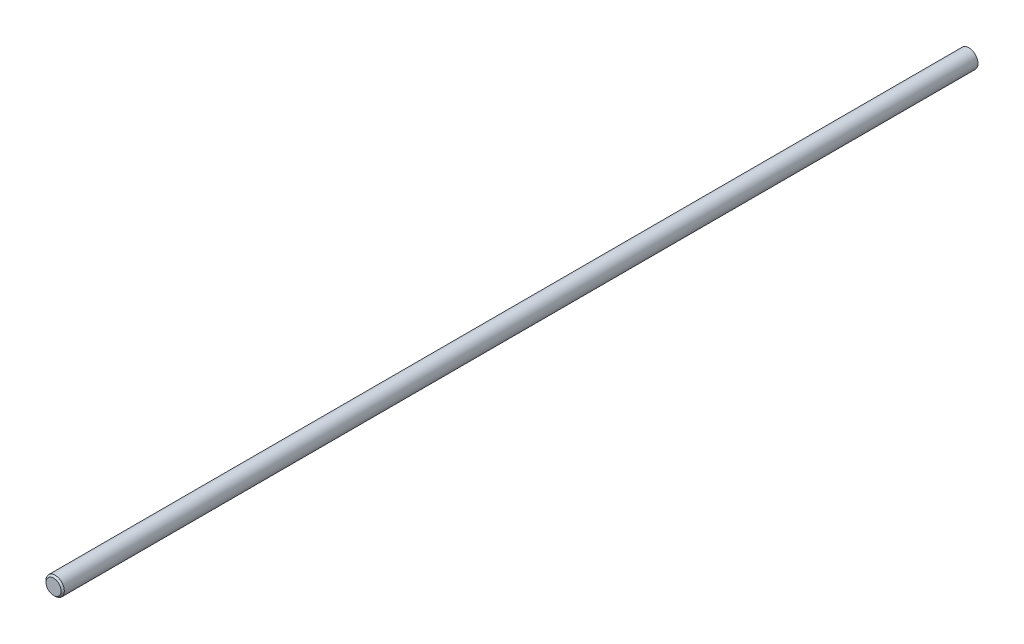
ISO-10303-21;
HEADER;
FILE_DESCRIPTION(('STEP AP214'),'2;1');
FILE_NAME('part.step','',(''),(''),'','','');
FILE_SCHEMA(('AUTOMOTIVE_DESIGN { 1 0 10303 214 1 1 1 1 }'));
ENDSEC;
DATA;
#1=APPLICATION_CONTEXT('core data for automotive mechanical design processes');
#2=APPLICATION_PROTOCOL_DEFINITION('international standard','automotive_design',2000,#1);
#3=PRODUCT_CONTEXT('',#1,'mechanical');
#4=PRODUCT('Part','Part','',(#3));
#5=PRODUCT_RELATED_PRODUCT_CATEGORY('part','',(#4));
#6=PRODUCT_DEFINITION_FORMATION('','',#4);
#7=PRODUCT_DEFINITION_CONTEXT('part definition',#1,'design');
#8=PRODUCT_DEFINITION('design','',#6,#7);
#9=PRODUCT_DEFINITION_SHAPE('','',#8);
#10=(LENGTH_UNIT() NAMED_UNIT(*) SI_UNIT(.MILLI.,.METRE.));
#11=(NAMED_UNIT(*) PLANE_ANGLE_UNIT() SI_UNIT($,.RADIAN.));
#12=(NAMED_UNIT(*) SI_UNIT($,.STERADIAN.) SOLID_ANGLE_UNIT());
#13=UNCERTAINTY_MEASURE_WITH_UNIT(LENGTH_MEASURE(1.E-05),#10,'distance_accuracy_value','');
#14=(GEOMETRIC_REPRESENTATION_CONTEXT(3) GLOBAL_UNCERTAINTY_ASSIGNED_CONTEXT((#13)) GLOBAL_UNIT_ASSIGNED_CONTEXT((#10,
#11,#12)) REPRESENTATION_CONTEXT('',''));
#15=CARTESIAN_POINT('',(0.,0.,0.));
#16=DIRECTION('',(0.,0.,1.));
#17=DIRECTION('',(1.,0.,0.));
#18=AXIS2_PLACEMENT_3D('',#15,#16,#17);
#19=CARTESIAN_POINT('',(0.,0.,250.));
#20=DIRECTION('',(0.,0.,-1.));
#21=DIRECTION('',(-1.,0.,0.));
#22=AXIS2_PLACEMENT_3D('',#19,#20,#21);
#23=CYLINDRICAL_SURFACE('',#22,2.5);
#24=CARTESIAN_POINT('',(0.,0.,249.555));
#25=DIRECTION('',(0.,0.,-1.));
#26=DIRECTION('',(-1.,0.,0.));
#27=AXIS2_PLACEMENT_3D('',#24,#25,#26);
#28=CIRCLE('',#27,2.49999999999998);
#29=CARTESIAN_POINT('',(-2.49999999999998,0.,249.555));
#30=VERTEX_POINT('',#29);
#31=EDGE_CURVE('E48',#30,#30,#28,.T.);
#32=ORIENTED_EDGE('',*,*,#31,.T.);
#33=EDGE_LOOP('',(#32));
#34=FACE_BOUND('',#33,.T.);
#35=CARTESIAN_POINT('',(0.,0.,0.));
#36=DIRECTION('',(0.,0.,1.));
#37=DIRECTION('',(1.,0.,0.));
#38=AXIS2_PLACEMENT_3D('',#35,#36,#37);
#39=CIRCLE('',#38,2.5);
#40=CARTESIAN_POINT('',(2.5,0.,0.));
#41=VERTEX_POINT('',#40);
#42=EDGE_CURVE('E10',#41,#41,#39,.T.);
#43=ORIENTED_EDGE('',*,*,#42,.T.);
#44=EDGE_LOOP('',(#43));
#45=FACE_BOUND('',#44,.T.);
#46=ADVANCED_FACE('F42',(#34,#45),#23,.T.);
#47=CARTESIAN_POINT('',(0.,0.,0.));
#48=DIRECTION('',(0.,0.,1.));
#49=DIRECTION('',(1.,0.,0.));
#50=AXIS2_PLACEMENT_3D('',#47,#48,#49);
#51=PLANE('',#50);
#52=ORIENTED_EDGE('',*,*,#42,.F.);
#53=EDGE_LOOP('',(#52));
#54=FACE_BOUND('',#53,.T.);
#55=ADVANCED_FACE('F67',(#54),#51,.F.);
#56=CARTESIAN_POINT('',(0.,0.,250.));
#57=DIRECTION('',(0.,0.,-1.));
#58=DIRECTION('',(-1.,0.,0.));
#59=AXIS2_PLACEMENT_3D('',#56,#57,#58);
#60=CONICAL_SURFACE('',#59,2.055,0.785398163397457);
#61=ORIENTED_EDGE('',*,*,#31,.F.);
#62=EDGE_LOOP('',(#61));
#63=FACE_BOUND('',#62,.T.);
#64=CARTESIAN_POINT('',(0.,0.,250.));
#65=DIRECTION('',(0.,0.,-1.));
#66=DIRECTION('',(-1.,0.,0.));
#67=AXIS2_PLACEMENT_3D('',#64,#65,#66);
#68=CIRCLE('',#67,2.055);
#69=CARTESIAN_POINT('',(-2.055,0.,250.));
#70=VERTEX_POINT('',#69);
#71=EDGE_CURVE('E52',#70,#70,#68,.T.);
#72=ORIENTED_EDGE('',*,*,#71,.T.);
#73=EDGE_LOOP('',(#72));
#74=FACE_BOUND('',#73,.T.);
#75=ADVANCED_FACE('F59',(#63,#74),#60,.T.);
#76=CARTESIAN_POINT('',(0.,0.,250.));
#77=DIRECTION('',(0.,0.,1.));
#78=DIRECTION('',(1.,0.,0.));
#79=AXIS2_PLACEMENT_3D('',#76,#77,#78);
#80=PLANE('',#79);
#81=ORIENTED_EDGE('',*,*,#71,.F.);
#82=EDGE_LOOP('',(#81));
#83=FACE_BOUND('',#82,.T.);
#84=ADVANCED_FACE('F61',(#83),#80,.T.);
#85=CLOSED_SHELL('',(#46,#55,#75,#84));
#86=MANIFOLD_SOLID_BREP('B2',#85);
#87=ADVANCED_BREP_SHAPE_REPRESENTATION('',(#18,#86),#14);
#88=SHAPE_DEFINITION_REPRESENTATION(#9,#87);
ENDSEC;
END-ISO-10303-21;
